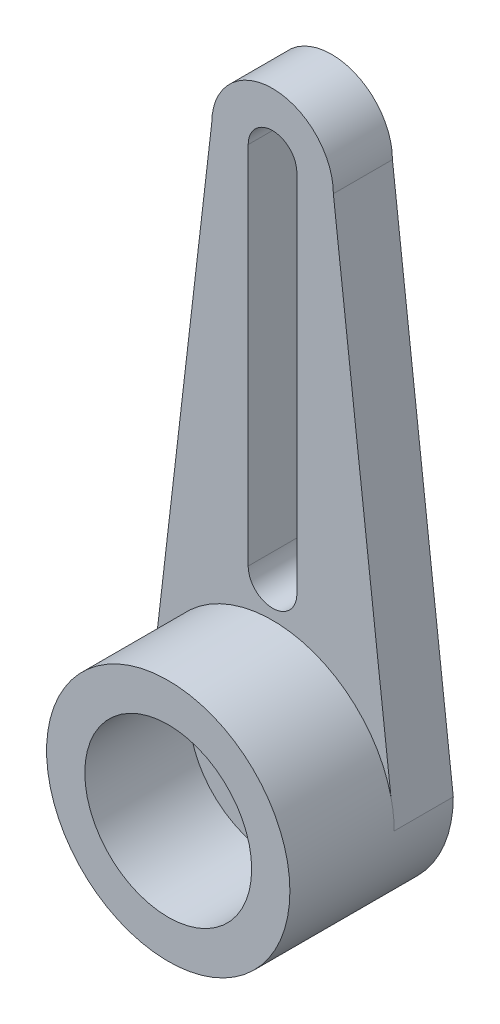
ISO-10303-21;
HEADER;
FILE_DESCRIPTION(('STEP AP214'),'2;1');
FILE_NAME('part.step','',(''),(''),'','','');
FILE_SCHEMA(('AUTOMOTIVE_DESIGN { 1 0 10303 214 1 1 1 1 }'));
ENDSEC;
DATA;
#1=APPLICATION_CONTEXT('core data for automotive mechanical design processes');
#2=APPLICATION_PROTOCOL_DEFINITION('international standard','automotive_design',2000,#1);
#3=PRODUCT_CONTEXT('',#1,'mechanical');
#4=PRODUCT('Part','Part','',(#3));
#5=PRODUCT_RELATED_PRODUCT_CATEGORY('part','',(#4));
#6=PRODUCT_DEFINITION_FORMATION('','',#4);
#7=PRODUCT_DEFINITION_CONTEXT('part definition',#1,'design');
#8=PRODUCT_DEFINITION('design','',#6,#7);
#9=PRODUCT_DEFINITION_SHAPE('','',#8);
#10=(LENGTH_UNIT() NAMED_UNIT(*) SI_UNIT(.MILLI.,.METRE.));
#11=(NAMED_UNIT(*) PLANE_ANGLE_UNIT() SI_UNIT($,.RADIAN.));
#12=(NAMED_UNIT(*) SI_UNIT($,.STERADIAN.) SOLID_ANGLE_UNIT());
#13=UNCERTAINTY_MEASURE_WITH_UNIT(LENGTH_MEASURE(1.E-05),#10,'distance_accuracy_value','');
#14=(GEOMETRIC_REPRESENTATION_CONTEXT(3) GLOBAL_UNCERTAINTY_ASSIGNED_CONTEXT((#13)) GLOBAL_UNIT_ASSIGNED_CONTEXT((#10,
#11,#12)) REPRESENTATION_CONTEXT('',''));
#15=CARTESIAN_POINT('',(0.,0.,0.));
#16=DIRECTION('',(0.,0.,1.));
#17=DIRECTION('',(1.,0.,0.));
#18=AXIS2_PLACEMENT_3D('',#15,#16,#17);
#19=CARTESIAN_POINT('',(0.,0.,1.7));
#20=DIRECTION('',(0.,0.,-1.));
#21=DIRECTION('',(-1.,0.,0.));
#22=AXIS2_PLACEMENT_3D('',#19,#20,#21);
#23=CYLINDRICAL_SURFACE('',#22,1.1);
#24=CARTESIAN_POINT('',(0.,0.,1.7));
#25=DIRECTION('',(0.,0.,1.));
#26=DIRECTION('',(1.,0.,0.));
#27=AXIS2_PLACEMENT_3D('',#24,#25,#26);
#28=CIRCLE('',#27,1.1);
#29=CARTESIAN_POINT('',(1.1,0.,1.7));
#30=VERTEX_POINT('',#29);
#31=EDGE_CURVE('E136',#30,#30,#28,.T.);
#32=ORIENTED_EDGE('',*,*,#31,.T.);
#33=EDGE_LOOP('',(#32));
#34=FACE_BOUND('',#33,.T.);
#35=CARTESIAN_POINT('',(0.,0.,1.));
#36=DIRECTION('',(0.,0.,-1.));
#37=DIRECTION('',(-1.,0.,0.));
#38=AXIS2_PLACEMENT_3D('',#35,#36,#37);
#39=CIRCLE('',#38,1.1);
#40=CARTESIAN_POINT('',(-1.1,0.,1.));
#41=VERTEX_POINT('',#40);
#42=EDGE_CURVE('E45',#41,#41,#39,.T.);
#43=ORIENTED_EDGE('',*,*,#42,.T.);
#44=EDGE_LOOP('',(#43));
#45=FACE_BOUND('',#44,.T.);
#46=ADVANCED_FACE('F41',(#34,#45),#23,.F.);
#47=CARTESIAN_POINT('',(0.,0.,1.7));
#48=DIRECTION('',(0.,0.,1.));
#49=DIRECTION('',(1.,0.,0.));
#50=AXIS2_PLACEMENT_3D('',#47,#48,#49);
#51=PLANE('',#50);
#52=ORIENTED_EDGE('',*,*,#31,.F.);
#53=EDGE_LOOP('',(#52));
#54=FACE_BOUND('',#53,.T.);
#55=CARTESIAN_POINT('',(0.,0.,1.7));
#56=DIRECTION('',(0.,0.,1.));
#57=DIRECTION('',(1.,0.,0.));
#58=AXIS2_PLACEMENT_3D('',#55,#56,#57);
#59=CIRCLE('',#58,2.4);
#60=CARTESIAN_POINT('',(2.4,0.,1.7));
#61=VERTEX_POINT('',#60);
#62=EDGE_CURVE('E305',#61,#61,#59,.T.);
#63=ORIENTED_EDGE('',*,*,#62,.T.);
#64=EDGE_LOOP('',(#63));
#65=FACE_BOUND('',#64,.T.);
#66=ADVANCED_FACE('F252',(#54,#65),#51,.T.);
#67=CARTESIAN_POINT('',(3.45300082214305,0.40285009591669,1.7));
#68=DIRECTION('',(0.993263139087243,0.115880699560178,0.));
#69=DIRECTION('',(-0.115880699560178,0.993263139087243,0.));
#70=AXIS2_PLACEMENT_3D('',#67,#68,#69);
#71=PLANE('',#70);
#72=DIRECTION('',(0.115880699560178,-0.993263139087243,0.));
#73=VECTOR('',#72,1.);
#74=CARTESIAN_POINT('',(3.45300082214305,0.40285009591669,0.));
#75=LINE('',#74,#73);
#76=CARTESIAN_POINT('',(1.75,15.,0.));
#77=VERTEX_POINT('',#76);
#78=CARTESIAN_POINT('',(3.5,0.,0.));
#79=VERTEX_POINT('',#78);
#80=EDGE_CURVE('E191',#77,#79,#75,.T.);
#81=ORIENTED_EDGE('',*,*,#80,.F.);
#82=DIRECTION('',(0.,0.,-1.));
#83=VECTOR('',#82,1.);
#84=CARTESIAN_POINT('',(1.75,15.,1.7));
#85=LINE('',#84,#83);
#86=CARTESIAN_POINT('',(1.75,15.,1.7));
#87=VERTEX_POINT('',#86);
#88=EDGE_CURVE('E51',#87,#77,#85,.T.);
#89=ORIENTED_EDGE('',*,*,#88,.F.);
#90=DIRECTION('',(0.115880699560178,-0.993263139087243,0.));
#91=VECTOR('',#90,1.);
#92=CARTESIAN_POINT('',(3.45300082214305,0.40285009591669,1.7));
#93=LINE('',#92,#91);
#94=CARTESIAN_POINT('',(3.40600164428611,0.805700191833378,1.7));
#95=VERTEX_POINT('',#94);
#96=EDGE_CURVE('E133',#87,#95,#93,.T.);
#97=ORIENTED_EDGE('',*,*,#96,.T.);
#98=CARTESIAN_POINT('',(3.5,0.,1.7));
#99=VERTEX_POINT('',#98);
#100=EDGE_CURVE('E131',#95,#99,#93,.T.);
#101=ORIENTED_EDGE('',*,*,#100,.T.);
#102=DIRECTION('',(0.,0.,-1.));
#103=VECTOR('',#102,1.);
#104=CARTESIAN_POINT('',(3.5,0.,1.7));
#105=LINE('',#104,#103);
#106=EDGE_CURVE('E116',#99,#79,#105,.T.);
#107=ORIENTED_EDGE('',*,*,#106,.T.);
#108=EDGE_LOOP('',(#81,#89,#97,#101,#107));
#109=FACE_BOUND('',#108,.T.);
#110=ADVANCED_FACE('F132',(#109),#71,.T.);
#111=CARTESIAN_POINT('',(0.,15.,1.7));
#112=DIRECTION('',(0.,0.,-1.));
#113=DIRECTION('',(-1.,0.,0.));
#114=AXIS2_PLACEMENT_3D('',#111,#112,#113);
#115=CYLINDRICAL_SURFACE('',#114,1.75);
#116=CARTESIAN_POINT('',(0.,15.,0.));
#117=DIRECTION('',(0.,0.,1.));
#118=DIRECTION('',(1.,0.,0.));
#119=AXIS2_PLACEMENT_3D('',#116,#117,#118);
#120=CIRCLE('',#119,1.75);
#121=CARTESIAN_POINT('',(-1.75,15.,0.));
#122=VERTEX_POINT('',#121);
#123=EDGE_CURVE('E194',#77,#122,#120,.T.);
#124=ORIENTED_EDGE('',*,*,#123,.T.);
#125=DIRECTION('',(0.,0.,-1.));
#126=VECTOR('',#125,1.);
#127=CARTESIAN_POINT('',(-1.75,15.,1.7));
#128=LINE('',#127,#126);
#129=CARTESIAN_POINT('',(-1.75,15.,1.7));
#130=VERTEX_POINT('',#129);
#131=EDGE_CURVE('E206',#130,#122,#128,.T.);
#132=ORIENTED_EDGE('',*,*,#131,.F.);
#133=CARTESIAN_POINT('',(0.,15.,1.7));
#134=DIRECTION('',(0.,0.,1.));
#135=DIRECTION('',(1.,0.,0.));
#136=AXIS2_PLACEMENT_3D('',#133,#134,#135);
#137=CIRCLE('',#136,1.75);
#138=EDGE_CURVE('E168',#87,#130,#137,.T.);
#139=ORIENTED_EDGE('',*,*,#138,.F.);
#140=ORIENTED_EDGE('',*,*,#88,.T.);
#141=EDGE_LOOP('',(#124,#132,#139,#140));
#142=FACE_BOUND('',#141,.T.);
#143=ADVANCED_FACE('F263',(#142),#115,.T.);
#144=CARTESIAN_POINT('',(-3.45300082214305,0.40285009591669,1.7));
#145=DIRECTION('',(0.993263139087243,-0.115880699560178,0.));
#146=DIRECTION('',(0.115880699560178,0.993263139087243,0.));
#147=AXIS2_PLACEMENT_3D('',#144,#145,#146);
#148=PLANE('',#147);
#149=DIRECTION('',(-0.115880699560178,-0.993263139087243,0.));
#150=VECTOR('',#149,1.);
#151=CARTESIAN_POINT('',(-3.45300082214305,0.40285009591669,0.));
#152=LINE('',#151,#150);
#153=CARTESIAN_POINT('',(-3.5,0.,0.));
#154=VERTEX_POINT('',#153);
#155=EDGE_CURVE('E198',#122,#154,#152,.T.);
#156=ORIENTED_EDGE('',*,*,#155,.T.);
#157=DIRECTION('',(0.,0.,-1.));
#158=VECTOR('',#157,1.);
#159=CARTESIAN_POINT('',(-3.5,0.,1.7));
#160=LINE('',#159,#158);
#161=CARTESIAN_POINT('',(-3.5,0.,1.7));
#162=VERTEX_POINT('',#161);
#163=EDGE_CURVE('E127',#162,#154,#160,.T.);
#164=ORIENTED_EDGE('',*,*,#163,.F.);
#165=DIRECTION('',(-0.115880699560178,-0.993263139087243,0.));
#166=VECTOR('',#165,1.);
#167=CARTESIAN_POINT('',(-3.45300082214305,0.40285009591669,1.7));
#168=LINE('',#167,#166);
#169=CARTESIAN_POINT('',(-3.40600164428611,0.805700191833378,1.7));
#170=VERTEX_POINT('',#169);
#171=EDGE_CURVE('E61',#170,#162,#168,.T.);
#172=ORIENTED_EDGE('',*,*,#171,.F.);
#173=EDGE_CURVE('E172',#130,#170,#168,.T.);
#174=ORIENTED_EDGE('',*,*,#173,.F.);
#175=ORIENTED_EDGE('',*,*,#131,.T.);
#176=EDGE_LOOP('',(#156,#164,#172,#174,#175));
#177=FACE_BOUND('',#176,.T.);
#178=ADVANCED_FACE('F266',(#177),#148,.F.);
#179=CARTESIAN_POINT('',(0.7,0.,1.7));
#180=DIRECTION('',(1.,0.,0.));
#181=DIRECTION('',(0.,1.,0.));
#182=AXIS2_PLACEMENT_3D('',#179,#180,#181);
#183=PLANE('',#182);
#184=DIRECTION('',(0.,-1.,0.));
#185=VECTOR('',#184,1.);
#186=CARTESIAN_POINT('',(0.7,0.,0.));
#187=LINE('',#186,#185);
#188=CARTESIAN_POINT('',(0.7,15.,0.));
#189=VERTEX_POINT('',#188);
#190=CARTESIAN_POINT('',(0.7,4.5,0.));
#191=VERTEX_POINT('',#190);
#192=EDGE_CURVE('E144',#189,#191,#187,.T.);
#193=ORIENTED_EDGE('',*,*,#192,.T.);
#194=DIRECTION('',(0.,0.,-1.));
#195=VECTOR('',#194,1.);
#196=CARTESIAN_POINT('',(0.7,4.5,1.7));
#197=LINE('',#196,#195);
#198=CARTESIAN_POINT('',(0.7,4.5,1.7));
#199=VERTEX_POINT('',#198);
#200=EDGE_CURVE('E128',#199,#191,#197,.T.);
#201=ORIENTED_EDGE('',*,*,#200,.F.);
#202=DIRECTION('',(0.,-1.,0.));
#203=VECTOR('',#202,1.);
#204=CARTESIAN_POINT('',(0.7,0.,1.7));
#205=LINE('',#204,#203);
#206=CARTESIAN_POINT('',(0.7,15.,1.7));
#207=VERTEX_POINT('',#206);
#208=EDGE_CURVE('E150',#207,#199,#205,.T.);
#209=ORIENTED_EDGE('',*,*,#208,.F.);
#210=DIRECTION('',(0.,0.,-1.));
#211=VECTOR('',#210,1.);
#212=CARTESIAN_POINT('',(0.7,15.,1.7));
#213=LINE('',#212,#211);
#214=EDGE_CURVE('E175',#207,#189,#213,.T.);
#215=ORIENTED_EDGE('',*,*,#214,.T.);
#216=EDGE_LOOP('',(#193,#201,#209,#215));
#217=FACE_BOUND('',#216,.T.);
#218=ADVANCED_FACE('F43',(#217),#183,.F.);
#219=CARTESIAN_POINT('',(0.,4.5,1.7));
#220=DIRECTION('',(0.,0.,-1.));
#221=DIRECTION('',(-1.,0.,0.));
#222=AXIS2_PLACEMENT_3D('',#219,#220,#221);
#223=CYLINDRICAL_SURFACE('',#222,0.7);
#224=CARTESIAN_POINT('',(0.,4.5,0.));
#225=DIRECTION('',(0.,0.,1.));
#226=DIRECTION('',(1.,0.,0.));
#227=AXIS2_PLACEMENT_3D('',#224,#225,#226);
#228=CIRCLE('',#227,0.7);
#229=CARTESIAN_POINT('',(-0.7,4.5,0.));
#230=VERTEX_POINT('',#229);
#231=EDGE_CURVE('E179',#230,#191,#228,.T.);
#232=ORIENTED_EDGE('',*,*,#231,.F.);
#233=DIRECTION('',(0.,0.,-1.));
#234=VECTOR('',#233,1.);
#235=CARTESIAN_POINT('',(-0.7,4.5,1.7));
#236=LINE('',#235,#234);
#237=CARTESIAN_POINT('',(-0.7,4.5,1.7));
#238=VERTEX_POINT('',#237);
#239=EDGE_CURVE('E217',#238,#230,#236,.T.);
#240=ORIENTED_EDGE('',*,*,#239,.F.);
#241=CARTESIAN_POINT('',(0.,4.5,1.7));
#242=DIRECTION('',(0.,0.,1.));
#243=DIRECTION('',(1.,0.,0.));
#244=AXIS2_PLACEMENT_3D('',#241,#242,#243);
#245=CIRCLE('',#244,0.7);
#246=EDGE_CURVE('E153',#238,#199,#245,.T.);
#247=ORIENTED_EDGE('',*,*,#246,.T.);
#248=ORIENTED_EDGE('',*,*,#200,.T.);
#249=EDGE_LOOP('',(#232,#240,#247,#248));
#250=FACE_BOUND('',#249,.T.);
#251=ADVANCED_FACE('F223',(#250),#223,.F.);
#252=CARTESIAN_POINT('',(-0.7,0.,1.7));
#253=DIRECTION('',(-1.,0.,0.));
#254=DIRECTION('',(0.,-1.,0.));
#255=AXIS2_PLACEMENT_3D('',#252,#253,#254);
#256=PLANE('',#255);
#257=DIRECTION('',(0.,1.,0.));
#258=VECTOR('',#257,1.);
#259=CARTESIAN_POINT('',(-0.7,0.,0.));
#260=LINE('',#259,#258);
#261=CARTESIAN_POINT('',(-0.7,15.,0.));
#262=VERTEX_POINT('',#261);
#263=EDGE_CURVE('E183',#230,#262,#260,.T.);
#264=ORIENTED_EDGE('',*,*,#263,.T.);
#265=DIRECTION('',(0.,0.,-1.));
#266=VECTOR('',#265,1.);
#267=CARTESIAN_POINT('',(-0.7,15.,1.7));
#268=LINE('',#267,#266);
#269=CARTESIAN_POINT('',(-0.7,15.,1.7));
#270=VERTEX_POINT('',#269);
#271=EDGE_CURVE('E214',#270,#262,#268,.T.);
#272=ORIENTED_EDGE('',*,*,#271,.F.);
#273=DIRECTION('',(0.,1.,0.));
#274=VECTOR('',#273,1.);
#275=CARTESIAN_POINT('',(-0.7,0.,1.7));
#276=LINE('',#275,#274);
#277=EDGE_CURVE('E157',#238,#270,#276,.T.);
#278=ORIENTED_EDGE('',*,*,#277,.F.);
#279=ORIENTED_EDGE('',*,*,#239,.T.);
#280=EDGE_LOOP('',(#264,#272,#278,#279));
#281=FACE_BOUND('',#280,.T.);
#282=ADVANCED_FACE('F235',(#281),#256,.F.);
#283=CARTESIAN_POINT('',(0.,15.,1.7));
#284=DIRECTION('',(0.,0.,-1.));
#285=DIRECTION('',(-1.,0.,0.));
#286=AXIS2_PLACEMENT_3D('',#283,#284,#285);
#287=CYLINDRICAL_SURFACE('',#286,0.7);
#288=CARTESIAN_POINT('',(0.,15.,0.));
#289=DIRECTION('',(0.,0.,1.));
#290=DIRECTION('',(1.,0.,0.));
#291=AXIS2_PLACEMENT_3D('',#288,#289,#290);
#292=CIRCLE('',#291,0.7);
#293=EDGE_CURVE('E187',#189,#262,#292,.T.);
#294=ORIENTED_EDGE('',*,*,#293,.F.);
#295=ORIENTED_EDGE('',*,*,#214,.F.);
#296=CARTESIAN_POINT('',(0.,15.,1.7));
#297=DIRECTION('',(0.,0.,1.));
#298=DIRECTION('',(1.,0.,0.));
#299=AXIS2_PLACEMENT_3D('',#296,#297,#298);
#300=CIRCLE('',#299,0.7);
#301=EDGE_CURVE('E160',#207,#270,#300,.T.);
#302=ORIENTED_EDGE('',*,*,#301,.T.);
#303=ORIENTED_EDGE('',*,*,#271,.T.);
#304=EDGE_LOOP('',(#294,#295,#302,#303));
#305=FACE_BOUND('',#304,.T.);
#306=ADVANCED_FACE('F241',(#305),#287,.F.);
#307=CARTESIAN_POINT('',(0.,0.,1.7));
#308=DIRECTION('',(0.,0.,-1.));
#309=DIRECTION('',(-1.,0.,0.));
#310=AXIS2_PLACEMENT_3D('',#307,#308,#309);
#311=CYLINDRICAL_SURFACE('',#310,3.5);
#312=CARTESIAN_POINT('',(0.,0.,0.));
#313=DIRECTION('',(0.,0.,1.));
#314=DIRECTION('',(1.,0.,0.));
#315=AXIS2_PLACEMENT_3D('',#312,#313,#314);
#316=CIRCLE('',#315,3.5);
#317=EDGE_CURVE('E122',#154,#79,#316,.T.);
#318=ORIENTED_EDGE('',*,*,#317,.T.);
#319=ORIENTED_EDGE('',*,*,#106,.F.);
#320=CARTESIAN_POINT('',(0.,0.,1.7));
#321=DIRECTION('',(0.,0.,1.));
#322=DIRECTION('',(1.,0.,0.));
#323=AXIS2_PLACEMENT_3D('',#320,#321,#322);
#324=CIRCLE('',#323,3.5);
#325=EDGE_CURVE('E53',#99,#95,#324,.T.);
#326=ORIENTED_EDGE('',*,*,#325,.T.);
#327=EDGE_CURVE('E11',#95,#170,#324,.T.);
#328=ORIENTED_EDGE('',*,*,#327,.T.);
#329=EDGE_CURVE('E54',#170,#162,#324,.T.);
#330=ORIENTED_EDGE('',*,*,#329,.T.);
#331=ORIENTED_EDGE('',*,*,#163,.T.);
#332=EDGE_LOOP('',(#318,#319,#326,#328,#330,#331));
#333=FACE_BOUND('',#332,.T.);
#334=CARTESIAN_POINT('',(0.,0.,4.7));
#335=DIRECTION('',(0.,0.,1.));
#336=DIRECTION('',(1.,0.,0.));
#337=AXIS2_PLACEMENT_3D('',#334,#335,#336);
#338=CIRCLE('',#337,3.5);
#339=CARTESIAN_POINT('',(3.5,0.,4.7));
#340=VERTEX_POINT('',#339);
#341=EDGE_CURVE('E140',#340,#340,#338,.T.);
#342=ORIENTED_EDGE('',*,*,#341,.F.);
#343=EDGE_LOOP('',(#342));
#344=FACE_BOUND('',#343,.T.);
#345=ADVANCED_FACE('F118',(#333,#344),#311,.T.);
#346=ORIENTED_EDGE('',*,*,#327,.F.);
#347=ORIENTED_EDGE('',*,*,#96,.F.);
#348=ORIENTED_EDGE('',*,*,#138,.T.);
#349=ORIENTED_EDGE('',*,*,#173,.T.);
#350=EDGE_LOOP('',(#346,#347,#348,#349));
#351=FACE_BOUND('',#350,.T.);
#352=ORIENTED_EDGE('',*,*,#208,.T.);
#353=ORIENTED_EDGE('',*,*,#246,.F.);
#354=ORIENTED_EDGE('',*,*,#277,.T.);
#355=ORIENTED_EDGE('',*,*,#301,.F.);
#356=EDGE_LOOP('',(#352,#353,#354,#355));
#357=FACE_BOUND('',#356,.T.);
#358=ADVANCED_FACE('F239',(#351,#357),#51,.T.);
#359=CARTESIAN_POINT('',(0.,0.,0.));
#360=DIRECTION('',(0.,0.,1.));
#361=DIRECTION('',(1.,0.,0.));
#362=AXIS2_PLACEMENT_3D('',#359,#360,#361);
#363=PLANE('',#362);
#364=CARTESIAN_POINT('',(0.,0.,0.));
#365=DIRECTION('',(0.,0.,-1.));
#366=DIRECTION('',(-1.,0.,0.));
#367=AXIS2_PLACEMENT_3D('',#364,#365,#366);
#368=CIRCLE('',#367,2.25);
#369=CARTESIAN_POINT('',(-2.25,0.,0.));
#370=VERTEX_POINT('',#369);
#371=EDGE_CURVE('E301',#370,#370,#368,.T.);
#372=ORIENTED_EDGE('',*,*,#371,.F.);
#373=EDGE_LOOP('',(#372));
#374=FACE_BOUND('',#373,.T.);
#375=ORIENTED_EDGE('',*,*,#192,.F.);
#376=ORIENTED_EDGE('',*,*,#293,.T.);
#377=ORIENTED_EDGE('',*,*,#263,.F.);
#378=ORIENTED_EDGE('',*,*,#231,.T.);
#379=EDGE_LOOP('',(#375,#376,#377,#378));
#380=FACE_BOUND('',#379,.T.);
#381=ORIENTED_EDGE('',*,*,#80,.T.);
#382=ORIENTED_EDGE('',*,*,#317,.F.);
#383=ORIENTED_EDGE('',*,*,#155,.F.);
#384=ORIENTED_EDGE('',*,*,#123,.F.);
#385=EDGE_LOOP('',(#381,#382,#383,#384));
#386=FACE_BOUND('',#385,.T.);
#387=ADVANCED_FACE('F231',(#374,#380,#386),#363,.F.);
#388=CARTESIAN_POINT('',(0.,0.,1.7));
#389=DIRECTION('',(0.,0.,1.));
#390=DIRECTION('',(1.,0.,0.));
#391=AXIS2_PLACEMENT_3D('',#388,#389,#390);
#392=PLANE('',#391);
#393=ORIENTED_EDGE('',*,*,#329,.F.);
#394=ORIENTED_EDGE('',*,*,#171,.T.);
#395=EDGE_LOOP('',(#393,#394));
#396=FACE_BOUND('',#395,.T.);
#397=ADVANCED_FACE('F271',(#396),#392,.F.);
#398=CARTESIAN_POINT('',(0.,0.,4.7));
#399=DIRECTION('',(0.,0.,1.));
#400=DIRECTION('',(1.,0.,0.));
#401=AXIS2_PLACEMENT_3D('',#398,#399,#400);
#402=PLANE('',#401);
#403=ORIENTED_EDGE('',*,*,#341,.T.);
#404=EDGE_LOOP('',(#403));
#405=FACE_BOUND('',#404,.T.);
#406=CARTESIAN_POINT('',(0.,0.,4.7));
#407=DIRECTION('',(0.,0.,1.));
#408=DIRECTION('',(1.,0.,0.));
#409=AXIS2_PLACEMENT_3D('',#406,#407,#408);
#410=CIRCLE('',#409,2.4);
#411=CARTESIAN_POINT('',(2.4,0.,4.7));
#412=VERTEX_POINT('',#411);
#413=EDGE_CURVE('E147',#412,#412,#410,.T.);
#414=ORIENTED_EDGE('',*,*,#413,.F.);
#415=EDGE_LOOP('',(#414));
#416=FACE_BOUND('',#415,.T.);
#417=ADVANCED_FACE('F278',(#405,#416),#402,.T.);
#418=ORIENTED_EDGE('',*,*,#100,.F.);
#419=ORIENTED_EDGE('',*,*,#325,.F.);
#420=EDGE_LOOP('',(#418,#419));
#421=FACE_BOUND('',#420,.T.);
#422=ADVANCED_FACE('F138',(#421),#392,.F.);
#423=CARTESIAN_POINT('',(0.,0.,4.7));
#424=DIRECTION('',(0.,0.,-1.));
#425=DIRECTION('',(-1.,0.,0.));
#426=AXIS2_PLACEMENT_3D('',#423,#424,#425);
#427=CYLINDRICAL_SURFACE('',#426,2.4);
#428=ORIENTED_EDGE('',*,*,#413,.T.);
#429=EDGE_LOOP('',(#428));
#430=FACE_BOUND('',#429,.T.);
#431=ORIENTED_EDGE('',*,*,#62,.F.);
#432=EDGE_LOOP('',(#431));
#433=FACE_BOUND('',#432,.T.);
#434=ADVANCED_FACE('F277',(#430,#433),#427,.F.);
#435=CARTESIAN_POINT('',(0.,0.,1.));
#436=DIRECTION('',(0.,0.,-1.));
#437=DIRECTION('',(-1.,0.,0.));
#438=AXIS2_PLACEMENT_3D('',#435,#436,#437);
#439=CYLINDRICAL_SURFACE('',#438,2.25);
#440=CARTESIAN_POINT('',(0.,0.,1.));
#441=DIRECTION('',(0.,0.,-1.));
#442=DIRECTION('',(-1.,0.,0.));
#443=AXIS2_PLACEMENT_3D('',#440,#441,#442);
#444=CIRCLE('',#443,2.25);
#445=CARTESIAN_POINT('',(-2.25,0.,1.));
#446=VERTEX_POINT('',#445);
#447=EDGE_CURVE('E299',#446,#446,#444,.T.);
#448=ORIENTED_EDGE('',*,*,#447,.F.);
#449=EDGE_LOOP('',(#448));
#450=FACE_BOUND('',#449,.T.);
#451=ORIENTED_EDGE('',*,*,#371,.T.);
#452=EDGE_LOOP('',(#451));
#453=FACE_BOUND('',#452,.T.);
#454=ADVANCED_FACE('F284',(#450,#453),#439,.F.);
#455=CARTESIAN_POINT('',(0.,0.,1.));
#456=DIRECTION('',(0.,0.,-1.));
#457=DIRECTION('',(-1.,0.,0.));
#458=AXIS2_PLACEMENT_3D('',#455,#456,#457);
#459=PLANE('',#458);
#460=ORIENTED_EDGE('',*,*,#42,.F.);
#461=EDGE_LOOP('',(#460));
#462=FACE_BOUND('',#461,.T.);
#463=ORIENTED_EDGE('',*,*,#447,.T.);
#464=EDGE_LOOP('',(#463));
#465=FACE_BOUND('',#464,.T.);
#466=ADVANCED_FACE('F288',(#462,#465),#459,.T.);
#467=CLOSED_SHELL('',(#46,#66,#110,#143,#178,#218,#251,#282,#306,#345,#358,#387,#397,#417,#422,
#434,#454,#466));
#468=MANIFOLD_SOLID_BREP('B2',#467);
#469=ADVANCED_BREP_SHAPE_REPRESENTATION('',(#18,#468),#14);
#470=SHAPE_DEFINITION_REPRESENTATION(#9,#469);
ENDSEC;
END-ISO-10303-21;
